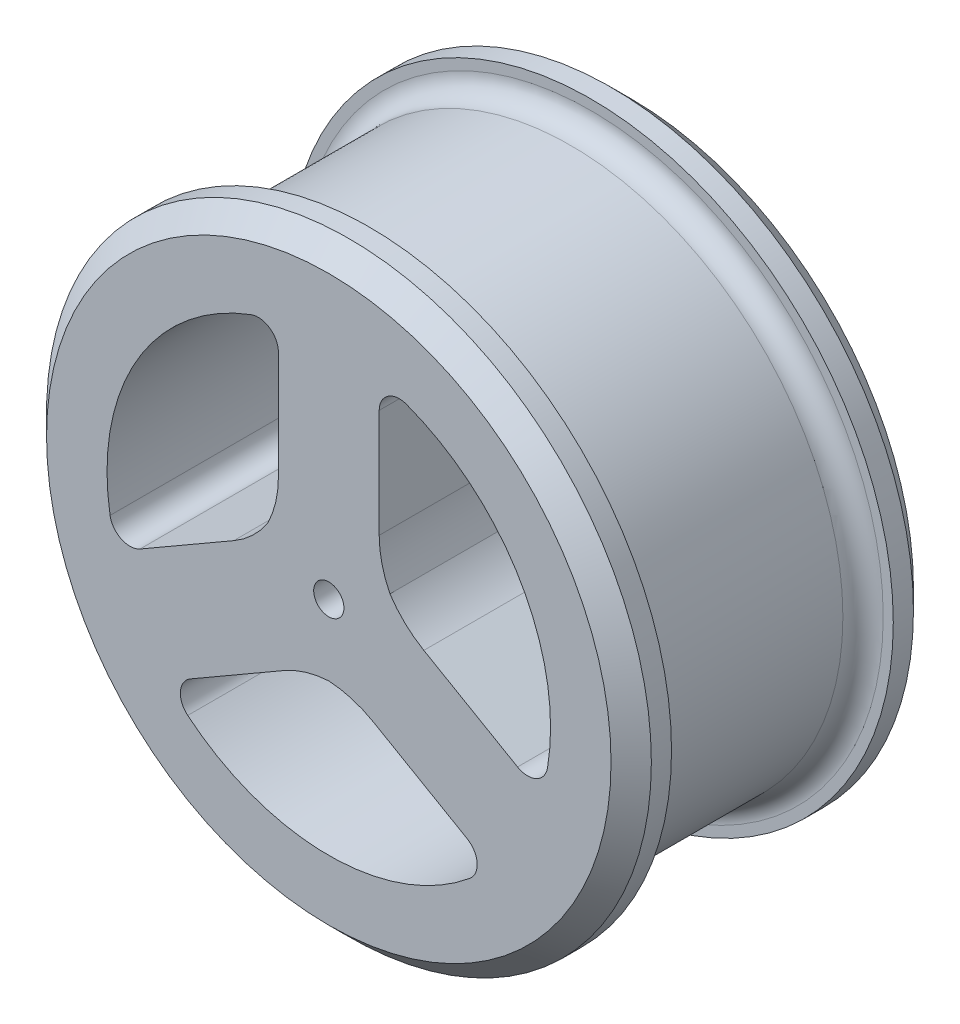
ISO-10303-21;
HEADER;
FILE_DESCRIPTION(('STEP AP214'),'2;1');
FILE_NAME('part.step','',(''),(''),'','','');
FILE_SCHEMA(('AUTOMOTIVE_DESIGN { 1 0 10303 214 1 1 1 1 }'));
ENDSEC;
DATA;
#1=APPLICATION_CONTEXT('core data for automotive mechanical design processes');
#2=APPLICATION_PROTOCOL_DEFINITION('international standard','automotive_design',2000,#1);
#3=PRODUCT_CONTEXT('',#1,'mechanical');
#4=PRODUCT('Part','Part','',(#3));
#5=PRODUCT_RELATED_PRODUCT_CATEGORY('part','',(#4));
#6=PRODUCT_DEFINITION_FORMATION('','',#4);
#7=PRODUCT_DEFINITION_CONTEXT('part definition',#1,'design');
#8=PRODUCT_DEFINITION('design','',#6,#7);
#9=PRODUCT_DEFINITION_SHAPE('','',#8);
#10=(LENGTH_UNIT() NAMED_UNIT(*) SI_UNIT(.MILLI.,.METRE.));
#11=(NAMED_UNIT(*) PLANE_ANGLE_UNIT() SI_UNIT($,.RADIAN.));
#12=(NAMED_UNIT(*) SI_UNIT($,.STERADIAN.) SOLID_ANGLE_UNIT());
#13=UNCERTAINTY_MEASURE_WITH_UNIT(LENGTH_MEASURE(1.E-05),#10,'distance_accuracy_value','');
#14=(GEOMETRIC_REPRESENTATION_CONTEXT(3) GLOBAL_UNCERTAINTY_ASSIGNED_CONTEXT((#13)) GLOBAL_UNIT_ASSIGNED_CONTEXT((#10,
#11,#12)) REPRESENTATION_CONTEXT('',''));
#15=CARTESIAN_POINT('',(0.,0.,0.));
#16=DIRECTION('',(0.,0.,1.));
#17=DIRECTION('',(1.,0.,0.));
#18=AXIS2_PLACEMENT_3D('',#15,#16,#17);
#19=CARTESIAN_POINT('',(0.,0.,15.));
#20=DIRECTION('',(0.,0.,-1.));
#21=DIRECTION('',(-1.,0.,0.));
#22=AXIS2_PLACEMENT_3D('',#19,#20,#21);
#23=CYLINDRICAL_SURFACE('',#22,15.);
#24=CARTESIAN_POINT('',(0.,0.,1.));
#25=DIRECTION('',(0.,0.,1.));
#26=DIRECTION('',(1.,0.,0.));
#27=AXIS2_PLACEMENT_3D('',#24,#25,#26);
#28=CIRCLE('',#27,15.);
#29=CARTESIAN_POINT('',(15.,0.,1.));
#30=VERTEX_POINT('',#29);
#31=EDGE_CURVE('E373',#30,#30,#28,.T.);
#32=ORIENTED_EDGE('',*,*,#31,.T.);
#33=EDGE_LOOP('',(#32));
#34=FACE_BOUND('',#33,.T.);
#35=CARTESIAN_POINT('',(0.,0.,2.));
#36=DIRECTION('',(0.,0.,1.));
#37=DIRECTION('',(1.,0.,0.));
#38=AXIS2_PLACEMENT_3D('',#35,#36,#37);
#39=CIRCLE('',#38,15.);
#40=CARTESIAN_POINT('',(15.,0.,2.));
#41=VERTEX_POINT('',#40);
#42=EDGE_CURVE('E263',#41,#41,#39,.T.);
#43=ORIENTED_EDGE('',*,*,#42,.F.);
#44=EDGE_LOOP('',(#43));
#45=FACE_BOUND('',#44,.T.);
#46=ADVANCED_FACE('F42',(#34,#45),#23,.T.);
#47=CARTESIAN_POINT('',(0.,0.,15.));
#48=DIRECTION('',(0.,0.,1.));
#49=DIRECTION('',(1.,0.,0.));
#50=AXIS2_PLACEMENT_3D('',#47,#48,#49);
#51=PLANE('',#50);
#52=CARTESIAN_POINT('',(0.,0.,15.));
#53=DIRECTION('',(0.,0.,1.));
#54=DIRECTION('',(1.,0.,0.));
#55=AXIS2_PLACEMENT_3D('',#52,#53,#54);
#56=CIRCLE('',#55,14.);
#57=CARTESIAN_POINT('',(14.,0.,15.));
#58=VERTEX_POINT('',#57);
#59=EDGE_CURVE('E51',#58,#58,#56,.T.);
#60=ORIENTED_EDGE('',*,*,#59,.T.);
#61=EDGE_LOOP('',(#60));
#62=FACE_BOUND('',#61,.T.);
#63=DIRECTION('',(0.,1.,0.));
#64=VECTOR('',#63,1.);
#65=CARTESIAN_POINT('',(-2.5,0.,15.));
#66=LINE('',#65,#64);
#67=CARTESIAN_POINT('',(-2.5,4.,15.));
#68=VERTEX_POINT('',#67);
#69=CARTESIAN_POINT('',(-2.5,9.3674969975976,15.));
#70=VERTEX_POINT('',#69);
#71=EDGE_CURVE('E238',#68,#70,#66,.T.);
#72=ORIENTED_EDGE('',*,*,#71,.F.);
#73=CARTESIAN_POINT('',(-7.5,4.,15.));
#74=DIRECTION('',(0.,0.,1.));
#75=DIRECTION('',(1.,0.,0.));
#76=AXIS2_PLACEMENT_3D('',#73,#74,#75);
#77=CIRCLE('',#76,5.);
#78=CARTESIAN_POINT('',(-3.03400829272474,1.7516855045282,15.));
#79=VERTEX_POINT('',#78);
#80=EDGE_CURVE('E312',#68,#79,#77,.F.);
#81=ORIENTED_EDGE('',*,*,#80,.T.);
#82=CARTESIAN_POINT('',(-7.21410161513773,4.49519052838332,15.));
#83=DIRECTION('',(0.,0.,1.));
#84=DIRECTION('',(1.,0.,0.));
#85=AXIS2_PLACEMENT_3D('',#82,#83,#84);
#86=CIRCLE('',#85,5.);
#87=CARTESIAN_POINT('',(-4.71410161513779,0.1650635094611,15.));
#88=VERTEX_POINT('',#87);
#89=EDGE_CURVE('E308',#79,#88,#86,.F.);
#90=ORIENTED_EDGE('',*,*,#89,.T.);
#91=DIRECTION('',(-0.866025403784445,-0.49999999999999,0.));
#92=VECTOR('',#91,1.);
#93=CARTESIAN_POINT('',(-1.24999999999996,2.16506350946109,15.));
#94=LINE('',#93,#92);
#95=CARTESIAN_POINT('',(-9.362490369794,-2.51868498933762,15.));
#96=VERTEX_POINT('',#95);
#97=EDGE_CURVE('E235',#88,#96,#94,.T.);
#98=ORIENTED_EDGE('',*,*,#97,.T.);
#99=CARTESIAN_POINT('',(-9.86249036979399,-1.65265958555317,15.));
#100=DIRECTION('',(0.,0.,1.));
#101=DIRECTION('',(1.,0.,0.));
#102=AXIS2_PLACEMENT_3D('',#99,#100,#101);
#103=CIRCLE('',#102,1.);
#104=CARTESIAN_POINT('',(-10.8487394067734,-1.81792554410849,15.));
#105=VERTEX_POINT('',#104);
#106=EDGE_CURVE('E352',#96,#105,#103,.F.);
#107=ORIENTED_EDGE('',*,*,#106,.T.);
#108=CARTESIAN_POINT('',(0.,0.,15.));
#109=DIRECTION('',(0.,0.,1.));
#110=DIRECTION('',(1.,0.,0.));
#111=AXIS2_PLACEMENT_3D('',#108,#109,#110);
#112=CIRCLE('',#111,11.);
#113=CARTESIAN_POINT('',(-3.85,10.3042466973574,15.));
#114=VERTEX_POINT('',#113);
#115=EDGE_CURVE('E241',#114,#105,#112,.T.);
#116=ORIENTED_EDGE('',*,*,#115,.F.);
#117=CARTESIAN_POINT('',(-3.5,9.3674969975976,15.));
#118=DIRECTION('',(0.,0.,1.));
#119=DIRECTION('',(1.,0.,0.));
#120=AXIS2_PLACEMENT_3D('',#117,#118,#119);
#121=CIRCLE('',#120,1.);
#122=EDGE_CURVE('E367',#114,#70,#121,.F.);
#123=ORIENTED_EDGE('',*,*,#122,.T.);
#124=EDGE_LOOP('',(#72,#81,#90,#98,#107,#116,#123));
#125=FACE_BOUND('',#124,.T.);
#126=CARTESIAN_POINT('',(0.285898384862207,-8.49519052838329,15.));
#127=DIRECTION('',(0.,0.,1.));
#128=DIRECTION('',(1.,0.,0.));
#129=AXIS2_PLACEMENT_3D('',#126,#127,#128);
#130=CIRCLE('',#129,5.);
#131=CARTESIAN_POINT('',(-2.21410161513774,-4.16506350946107,15.));
#132=VERTEX_POINT('',#131);
#133=CARTESIAN_POINT('',(0.,-3.50337100905638,15.));
#134=VERTEX_POINT('',#133);
#135=EDGE_CURVE('E189',#132,#134,#130,.F.);
#136=ORIENTED_EDGE('',*,*,#135,.T.);
#137=CARTESIAN_POINT('',(-0.285898384862262,-8.49519052838329,15.));
#138=DIRECTION('',(0.,0.,1.));
#139=DIRECTION('',(1.,0.,0.));
#140=AXIS2_PLACEMENT_3D('',#137,#138,#139);
#141=CIRCLE('',#140,5.);
#142=CARTESIAN_POINT('',(2.21410161513777,-4.16506350946111,15.));
#143=VERTEX_POINT('',#142);
#144=EDGE_CURVE('E296',#134,#143,#141,.F.);
#145=ORIENTED_EDGE('',*,*,#144,.T.);
#146=DIRECTION('',(0.866025403784436,-0.500000000000005,0.));
#147=VECTOR('',#146,1.);
#148=CARTESIAN_POINT('',(-1.25000000000001,-2.16506350946108,15.));
#149=LINE('',#148,#147);
#150=CARTESIAN_POINT('',(6.86249036979395,-6.84881200825993,15.));
#151=VERTEX_POINT('',#150);
#152=EDGE_CURVE('E221',#143,#151,#149,.T.);
#153=ORIENTED_EDGE('',*,*,#152,.T.);
#154=CARTESIAN_POINT('',(6.36249036979394,-7.71483741204436,15.));
#155=DIRECTION('',(0.,0.,1.));
#156=DIRECTION('',(1.,0.,0.));
#157=AXIS2_PLACEMENT_3D('',#154,#155,#156);
#158=CIRCLE('',#157,1.);
#159=CARTESIAN_POINT('',(6.99873940677333,-8.4863211532488,15.));
#160=VERTEX_POINT('',#159);
#161=EDGE_CURVE('E359',#151,#160,#158,.F.);
#162=ORIENTED_EDGE('',*,*,#161,.T.);
#163=CARTESIAN_POINT('',(0.,0.,15.));
#164=DIRECTION('',(0.,0.,1.));
#165=DIRECTION('',(1.,0.,0.));
#166=AXIS2_PLACEMENT_3D('',#163,#164,#165);
#167=CIRCLE('',#166,11.);
#168=CARTESIAN_POINT('',(-6.99873940677345,-8.4863211532487,15.));
#169=VERTEX_POINT('',#168);
#170=EDGE_CURVE('E217',#169,#160,#167,.T.);
#171=ORIENTED_EDGE('',*,*,#170,.F.);
#172=CARTESIAN_POINT('',(-6.36249036979404,-7.71483741204428,15.));
#173=DIRECTION('',(0.,0.,1.));
#174=DIRECTION('',(1.,0.,0.));
#175=AXIS2_PLACEMENT_3D('',#172,#173,#174);
#176=CIRCLE('',#175,1.);
#177=CARTESIAN_POINT('',(-6.86249036979403,-6.84881200825983,15.));
#178=VERTEX_POINT('',#177);
#179=EDGE_CURVE('E216',#169,#178,#176,.F.);
#180=ORIENTED_EDGE('',*,*,#179,.T.);
#181=DIRECTION('',(-0.866025403784445,-0.499999999999989,0.));
#182=VECTOR('',#181,1.);
#183=CARTESIAN_POINT('',(1.24999999999999,-2.16506350946114,15.));
#184=LINE('',#183,#182);
#185=EDGE_CURVE('E206',#132,#178,#184,.T.);
#186=ORIENTED_EDGE('',*,*,#185,.F.);
#187=EDGE_LOOP('',(#136,#145,#153,#162,#171,#180,#186));
#188=FACE_BOUND('',#187,.T.);
#189=CARTESIAN_POINT('',(7.21410161513777,4.49519052838327,15.));
#190=DIRECTION('',(0.,0.,1.));
#191=DIRECTION('',(1.,0.,0.));
#192=AXIS2_PLACEMENT_3D('',#189,#190,#191);
#193=CIRCLE('',#192,5.);
#194=CARTESIAN_POINT('',(4.71410161513774,0.165063509461094,15.));
#195=VERTEX_POINT('',#194);
#196=CARTESIAN_POINT('',(3.03400829272474,1.75168550452819,15.));
#197=VERTEX_POINT('',#196);
#198=EDGE_CURVE('E300',#195,#197,#193,.F.);
#199=ORIENTED_EDGE('',*,*,#198,.T.);
#200=CARTESIAN_POINT('',(7.5,4.,15.));
#201=DIRECTION('',(0.,0.,1.));
#202=DIRECTION('',(1.,0.,0.));
#203=AXIS2_PLACEMENT_3D('',#200,#201,#202);
#204=CIRCLE('',#203,5.);
#205=CARTESIAN_POINT('',(2.5,4.,15.));
#206=VERTEX_POINT('',#205);
#207=EDGE_CURVE('E304',#197,#206,#204,.F.);
#208=ORIENTED_EDGE('',*,*,#207,.T.);
#209=DIRECTION('',(0.,1.,0.));
#210=VECTOR('',#209,1.);
#211=CARTESIAN_POINT('',(2.5,0.,15.));
#212=LINE('',#211,#210);
#213=CARTESIAN_POINT('',(2.5,9.3674969975976,15.));
#214=VERTEX_POINT('',#213);
#215=EDGE_CURVE('E250',#206,#214,#212,.T.);
#216=ORIENTED_EDGE('',*,*,#215,.T.);
#217=CARTESIAN_POINT('',(3.5,9.3674969975976,15.));
#218=DIRECTION('',(0.,0.,1.));
#219=DIRECTION('',(1.,0.,0.));
#220=AXIS2_PLACEMENT_3D('',#217,#218,#219);
#221=CIRCLE('',#220,1.);
#222=CARTESIAN_POINT('',(3.85,10.3042466973574,15.));
#223=VERTEX_POINT('',#222);
#224=EDGE_CURVE('E66',#214,#223,#221,.F.);
#225=ORIENTED_EDGE('',*,*,#224,.T.);
#226=CARTESIAN_POINT('',(0.,0.,15.));
#227=DIRECTION('',(0.,0.,1.));
#228=DIRECTION('',(1.,0.,0.));
#229=AXIS2_PLACEMENT_3D('',#226,#227,#228);
#230=CIRCLE('',#229,11.);
#231=CARTESIAN_POINT('',(10.8487394067734,-1.81792554410864,15.));
#232=VERTEX_POINT('',#231);
#233=EDGE_CURVE('E258',#232,#223,#230,.T.);
#234=ORIENTED_EDGE('',*,*,#233,.F.);
#235=CARTESIAN_POINT('',(9.86249036979397,-1.65265958555331,15.));
#236=DIRECTION('',(0.,0.,1.));
#237=DIRECTION('',(1.,0.,0.));
#238=AXIS2_PLACEMENT_3D('',#235,#236,#237);
#239=CIRCLE('',#238,1.);
#240=CARTESIAN_POINT('',(9.36249036979396,-2.51868498933774,15.));
#241=VERTEX_POINT('',#240);
#242=EDGE_CURVE('E363',#232,#241,#239,.F.);
#243=ORIENTED_EDGE('',*,*,#242,.T.);
#244=DIRECTION('',(0.866025403784436,-0.500000000000005,0.));
#245=VECTOR('',#244,1.);
#246=CARTESIAN_POINT('',(1.25000000000002,2.1650635094611,15.));
#247=LINE('',#246,#245);
#248=EDGE_CURVE('E255',#195,#241,#247,.T.);
#249=ORIENTED_EDGE('',*,*,#248,.F.);
#250=EDGE_LOOP('',(#199,#208,#216,#225,#234,#243,#249));
#251=FACE_BOUND('',#250,.T.);
#252=CARTESIAN_POINT('',(0.,0.,15.));
#253=DIRECTION('',(0.,0.,1.));
#254=DIRECTION('',(1.,0.,0.));
#255=AXIS2_PLACEMENT_3D('',#252,#253,#254);
#256=CIRCLE('',#255,0.75);
#257=CARTESIAN_POINT('',(0.75,0.,15.));
#258=VERTEX_POINT('',#257);
#259=EDGE_CURVE('E269',#258,#258,#256,.T.);
#260=ORIENTED_EDGE('',*,*,#259,.F.);
#261=EDGE_LOOP('',(#260));
#262=FACE_BOUND('',#261,.T.);
#263=ADVANCED_FACE('F213',(#62,#125,#188,#251,#262),#51,.T.);
#264=CARTESIAN_POINT('',(0.,0.,0.));
#265=DIRECTION('',(0.,0.,1.));
#266=DIRECTION('',(1.,0.,0.));
#267=AXIS2_PLACEMENT_3D('',#264,#265,#266);
#268=PLANE('',#267);
#269=CARTESIAN_POINT('',(0.,0.,0.));
#270=DIRECTION('',(0.,0.,1.));
#271=DIRECTION('',(1.,0.,0.));
#272=AXIS2_PLACEMENT_3D('',#269,#270,#271);
#273=CIRCLE('',#272,14.);
#274=CARTESIAN_POINT('',(14.,0.,0.));
#275=VERTEX_POINT('',#274);
#276=EDGE_CURVE('E376',#275,#275,#273,.F.);
#277=ORIENTED_EDGE('',*,*,#276,.T.);
#278=EDGE_LOOP('',(#277));
#279=FACE_BOUND('',#278,.T.);
#280=CARTESIAN_POINT('',(-7.21410161513773,4.49519052838332,0.));
#281=DIRECTION('',(0.,0.,1.));
#282=DIRECTION('',(1.,0.,0.));
#283=AXIS2_PLACEMENT_3D('',#280,#281,#282);
#284=CIRCLE('',#283,5.);
#285=CARTESIAN_POINT('',(-4.71410161513779,0.1650635094611,0.));
#286=VERTEX_POINT('',#285);
#287=CARTESIAN_POINT('',(-3.03400829272474,1.7516855045282,0.));
#288=VERTEX_POINT('',#287);
#289=EDGE_CURVE('E310',#286,#288,#284,.T.);
#290=ORIENTED_EDGE('',*,*,#289,.T.);
#291=CARTESIAN_POINT('',(-7.5,4.,0.));
#292=DIRECTION('',(0.,0.,1.));
#293=DIRECTION('',(1.,0.,0.));
#294=AXIS2_PLACEMENT_3D('',#291,#292,#293);
#295=CIRCLE('',#294,5.);
#296=CARTESIAN_POINT('',(-2.5,4.,0.));
#297=VERTEX_POINT('',#296);
#298=EDGE_CURVE('E314',#288,#297,#295,.T.);
#299=ORIENTED_EDGE('',*,*,#298,.T.);
#300=DIRECTION('',(0.,1.,0.));
#301=VECTOR('',#300,1.);
#302=CARTESIAN_POINT('',(-2.5,0.,0.));
#303=LINE('',#302,#301);
#304=CARTESIAN_POINT('',(-2.5,9.3674969975976,0.));
#305=VERTEX_POINT('',#304);
#306=EDGE_CURVE('E232',#297,#305,#303,.T.);
#307=ORIENTED_EDGE('',*,*,#306,.T.);
#308=CARTESIAN_POINT('',(-3.5,9.3674969975976,0.));
#309=DIRECTION('',(0.,0.,1.));
#310=DIRECTION('',(1.,0.,0.));
#311=AXIS2_PLACEMENT_3D('',#308,#309,#310);
#312=CIRCLE('',#311,1.);
#313=CARTESIAN_POINT('',(-3.85,10.3042466973574,0.));
#314=VERTEX_POINT('',#313);
#315=EDGE_CURVE('E369',#305,#314,#312,.T.);
#316=ORIENTED_EDGE('',*,*,#315,.T.);
#317=CARTESIAN_POINT('',(0.,0.,0.));
#318=DIRECTION('',(0.,0.,1.));
#319=DIRECTION('',(1.,0.,0.));
#320=AXIS2_PLACEMENT_3D('',#317,#318,#319);
#321=CIRCLE('',#320,11.);
#322=CARTESIAN_POINT('',(-10.8487394067734,-1.81792554410849,0.));
#323=VERTEX_POINT('',#322);
#324=EDGE_CURVE('E224',#314,#323,#321,.T.);
#325=ORIENTED_EDGE('',*,*,#324,.T.);
#326=CARTESIAN_POINT('',(-9.86249036979399,-1.65265958555317,0.));
#327=DIRECTION('',(0.,0.,1.));
#328=DIRECTION('',(1.,0.,0.));
#329=AXIS2_PLACEMENT_3D('',#326,#327,#328);
#330=CIRCLE('',#329,1.);
#331=CARTESIAN_POINT('',(-9.362490369794,-2.51868498933762,0.));
#332=VERTEX_POINT('',#331);
#333=EDGE_CURVE('E354',#323,#332,#330,.T.);
#334=ORIENTED_EDGE('',*,*,#333,.T.);
#335=DIRECTION('',(-0.866025403784445,-0.49999999999999,0.));
#336=VECTOR('',#335,1.);
#337=CARTESIAN_POINT('',(-1.24999999999996,2.16506350946109,0.));
#338=LINE('',#337,#336);
#339=EDGE_CURVE('E218',#286,#332,#338,.T.);
#340=ORIENTED_EDGE('',*,*,#339,.F.);
#341=EDGE_LOOP('',(#290,#299,#307,#316,#325,#334,#340));
#342=FACE_BOUND('',#341,.T.);
#343=DIRECTION('',(0.866025403784436,-0.500000000000005,0.));
#344=VECTOR('',#343,1.);
#345=CARTESIAN_POINT('',(-1.25000000000001,-2.16506350946108,0.));
#346=LINE('',#345,#344);
#347=CARTESIAN_POINT('',(2.21410161513777,-4.16506350946111,0.));
#348=VERTEX_POINT('',#347);
#349=CARTESIAN_POINT('',(6.86249036979395,-6.84881200825993,0.));
#350=VERTEX_POINT('',#349);
#351=EDGE_CURVE('E227',#348,#350,#346,.T.);
#352=ORIENTED_EDGE('',*,*,#351,.F.);
#353=CARTESIAN_POINT('',(-0.285898384862262,-8.49519052838329,0.));
#354=DIRECTION('',(0.,0.,1.));
#355=DIRECTION('',(1.,0.,0.));
#356=AXIS2_PLACEMENT_3D('',#353,#354,#355);
#357=CIRCLE('',#356,5.);
#358=CARTESIAN_POINT('',(0.,-3.50337100905638,0.));
#359=VERTEX_POINT('',#358);
#360=EDGE_CURVE('E298',#348,#359,#357,.T.);
#361=ORIENTED_EDGE('',*,*,#360,.T.);
#362=CARTESIAN_POINT('',(0.285898384862207,-8.49519052838329,0.));
#363=DIRECTION('',(0.,0.,1.));
#364=DIRECTION('',(1.,0.,0.));
#365=AXIS2_PLACEMENT_3D('',#362,#363,#364);
#366=CIRCLE('',#365,5.);
#367=CARTESIAN_POINT('',(-2.21410161513774,-4.16506350946107,0.));
#368=VERTEX_POINT('',#367);
#369=EDGE_CURVE('E199',#359,#368,#366,.T.);
#370=ORIENTED_EDGE('',*,*,#369,.T.);
#371=DIRECTION('',(-0.866025403784445,-0.499999999999989,0.));
#372=VECTOR('',#371,1.);
#373=CARTESIAN_POINT('',(1.24999999999999,-2.16506350946114,0.));
#374=LINE('',#373,#372);
#375=CARTESIAN_POINT('',(-6.86249036979403,-6.84881200825983,0.));
#376=VERTEX_POINT('',#375);
#377=EDGE_CURVE('E209',#368,#376,#374,.T.);
#378=ORIENTED_EDGE('',*,*,#377,.T.);
#379=CARTESIAN_POINT('',(-6.36249036979404,-7.71483741204428,0.));
#380=DIRECTION('',(0.,0.,1.));
#381=DIRECTION('',(1.,0.,0.));
#382=AXIS2_PLACEMENT_3D('',#379,#380,#381);
#383=CIRCLE('',#382,1.);
#384=CARTESIAN_POINT('',(-6.99873940677345,-8.4863211532487,0.));
#385=VERTEX_POINT('',#384);
#386=EDGE_CURVE('E357',#376,#385,#383,.T.);
#387=ORIENTED_EDGE('',*,*,#386,.T.);
#388=CARTESIAN_POINT('',(0.,0.,0.));
#389=DIRECTION('',(0.,0.,1.));
#390=DIRECTION('',(1.,0.,0.));
#391=AXIS2_PLACEMENT_3D('',#388,#389,#390);
#392=CIRCLE('',#391,11.);
#393=CARTESIAN_POINT('',(6.99873940677333,-8.4863211532488,0.));
#394=VERTEX_POINT('',#393);
#395=EDGE_CURVE('E477',#385,#394,#392,.T.);
#396=ORIENTED_EDGE('',*,*,#395,.T.);
#397=CARTESIAN_POINT('',(6.36249036979394,-7.71483741204436,0.));
#398=DIRECTION('',(0.,0.,1.));
#399=DIRECTION('',(1.,0.,0.));
#400=AXIS2_PLACEMENT_3D('',#397,#398,#399);
#401=CIRCLE('',#400,1.);
#402=EDGE_CURVE('E361',#394,#350,#401,.T.);
#403=ORIENTED_EDGE('',*,*,#402,.T.);
#404=EDGE_LOOP('',(#352,#361,#370,#378,#387,#396,#403));
#405=FACE_BOUND('',#404,.T.);
#406=DIRECTION('',(0.,1.,0.));
#407=VECTOR('',#406,1.);
#408=CARTESIAN_POINT('',(2.5,0.,0.));
#409=LINE('',#408,#407);
#410=CARTESIAN_POINT('',(2.5,4.,0.));
#411=VERTEX_POINT('',#410);
#412=CARTESIAN_POINT('',(2.5,9.3674969975976,0.));
#413=VERTEX_POINT('',#412);
#414=EDGE_CURVE('E252',#411,#413,#409,.T.);
#415=ORIENTED_EDGE('',*,*,#414,.F.);
#416=CARTESIAN_POINT('',(7.5,4.,0.));
#417=DIRECTION('',(0.,0.,1.));
#418=DIRECTION('',(1.,0.,0.));
#419=AXIS2_PLACEMENT_3D('',#416,#417,#418);
#420=CIRCLE('',#419,5.);
#421=CARTESIAN_POINT('',(3.03400829272474,1.75168550452819,0.));
#422=VERTEX_POINT('',#421);
#423=EDGE_CURVE('E306',#411,#422,#420,.T.);
#424=ORIENTED_EDGE('',*,*,#423,.T.);
#425=CARTESIAN_POINT('',(7.21410161513777,4.49519052838327,0.));
#426=DIRECTION('',(0.,0.,1.));
#427=DIRECTION('',(1.,0.,0.));
#428=AXIS2_PLACEMENT_3D('',#425,#426,#427);
#429=CIRCLE('',#428,5.);
#430=CARTESIAN_POINT('',(4.71410161513774,0.165063509461094,0.));
#431=VERTEX_POINT('',#430);
#432=EDGE_CURVE('E302',#422,#431,#429,.T.);
#433=ORIENTED_EDGE('',*,*,#432,.T.);
#434=DIRECTION('',(0.866025403784436,-0.500000000000005,0.));
#435=VECTOR('',#434,1.);
#436=CARTESIAN_POINT('',(1.25000000000002,2.1650635094611,0.));
#437=LINE('',#436,#435);
#438=CARTESIAN_POINT('',(9.36249036979396,-2.51868498933774,0.));
#439=VERTEX_POINT('',#438);
#440=EDGE_CURVE('E246',#431,#439,#437,.T.);
#441=ORIENTED_EDGE('',*,*,#440,.T.);
#442=CARTESIAN_POINT('',(9.86249036979397,-1.65265958555331,0.));
#443=DIRECTION('',(0.,0.,1.));
#444=DIRECTION('',(1.,0.,0.));
#445=AXIS2_PLACEMENT_3D('',#442,#443,#444);
#446=CIRCLE('',#445,1.);
#447=CARTESIAN_POINT('',(10.8487394067734,-1.81792554410864,0.));
#448=VERTEX_POINT('',#447);
#449=EDGE_CURVE('E365',#439,#448,#446,.T.);
#450=ORIENTED_EDGE('',*,*,#449,.T.);
#451=CARTESIAN_POINT('',(0.,0.,0.));
#452=DIRECTION('',(0.,0.,1.));
#453=DIRECTION('',(1.,0.,0.));
#454=AXIS2_PLACEMENT_3D('',#451,#452,#453);
#455=CIRCLE('',#454,11.);
#456=CARTESIAN_POINT('',(3.85,10.3042466973574,0.));
#457=VERTEX_POINT('',#456);
#458=EDGE_CURVE('E249',#448,#457,#455,.T.);
#459=ORIENTED_EDGE('',*,*,#458,.T.);
#460=CARTESIAN_POINT('',(3.5,9.3674969975976,0.));
#461=DIRECTION('',(0.,0.,1.));
#462=DIRECTION('',(1.,0.,0.));
#463=AXIS2_PLACEMENT_3D('',#460,#461,#462);
#464=CIRCLE('',#463,1.);
#465=EDGE_CURVE('E58',#457,#413,#464,.T.);
#466=ORIENTED_EDGE('',*,*,#465,.T.);
#467=EDGE_LOOP('',(#415,#424,#433,#441,#450,#459,#466));
#468=FACE_BOUND('',#467,.T.);
#469=CARTESIAN_POINT('',(0.,0.,0.));
#470=DIRECTION('',(0.,0.,1.));
#471=DIRECTION('',(1.,0.,0.));
#472=AXIS2_PLACEMENT_3D('',#469,#470,#471);
#473=CIRCLE('',#472,0.75);
#474=CARTESIAN_POINT('',(0.75,0.,0.));
#475=VERTEX_POINT('',#474);
#476=EDGE_CURVE('E266',#475,#475,#473,.T.);
#477=ORIENTED_EDGE('',*,*,#476,.T.);
#478=EDGE_LOOP('',(#477));
#479=FACE_BOUND('',#478,.T.);
#480=ADVANCED_FACE('F399',(#279,#342,#405,#468,#479),#268,.F.);
#481=CARTESIAN_POINT('',(0.,0.,14.));
#482=DIRECTION('',(0.,0.,1.));
#483=DIRECTION('',(1.,0.,0.));
#484=AXIS2_PLACEMENT_3D('',#481,#482,#483);
#485=CIRCLE('',#484,15.);
#486=CARTESIAN_POINT('',(15.,0.,14.));
#487=VERTEX_POINT('',#486);
#488=EDGE_CURVE('E11',#487,#487,#485,.F.);
#489=ORIENTED_EDGE('',*,*,#488,.T.);
#490=EDGE_LOOP('',(#489));
#491=FACE_BOUND('',#490,.T.);
#492=CARTESIAN_POINT('',(0.,0.,13.));
#493=DIRECTION('',(0.,0.,1.));
#494=DIRECTION('',(1.,0.,0.));
#495=AXIS2_PLACEMENT_3D('',#492,#493,#494);
#496=CIRCLE('',#495,15.);
#497=CARTESIAN_POINT('',(15.,0.,13.));
#498=VERTEX_POINT('',#497);
#499=EDGE_CURVE('E254',#498,#498,#496,.T.);
#500=ORIENTED_EDGE('',*,*,#499,.T.);
#501=EDGE_LOOP('',(#500));
#502=FACE_BOUND('',#501,.T.);
#503=ADVANCED_FACE('F395',(#491,#502),#23,.T.);
#504=CARTESIAN_POINT('',(0.,0.,15.));
#505=DIRECTION('',(0.,0.,-1.));
#506=DIRECTION('',(-1.,0.,0.));
#507=AXIS2_PLACEMENT_3D('',#504,#505,#506);
#508=CYLINDRICAL_SURFACE('',#507,0.75);
#509=ORIENTED_EDGE('',*,*,#259,.T.);
#510=EDGE_LOOP('',(#509));
#511=FACE_BOUND('',#510,.T.);
#512=ORIENTED_EDGE('',*,*,#476,.F.);
#513=EDGE_LOOP('',(#512));
#514=FACE_BOUND('',#513,.T.);
#515=ADVANCED_FACE('F405',(#511,#514),#508,.F.);
#516=CARTESIAN_POINT('',(0.,0.,2.));
#517=DIRECTION('',(0.,0.,1.));
#518=DIRECTION('',(1.,0.,0.));
#519=AXIS2_PLACEMENT_3D('',#516,#517,#518);
#520=PLANE('',#519);
#521=CARTESIAN_POINT('',(0.,0.,2.));
#522=DIRECTION('',(0.,0.,1.));
#523=DIRECTION('',(1.,0.,0.));
#524=AXIS2_PLACEMENT_3D('',#521,#522,#523);
#525=CIRCLE('',#524,14.5);
#526=CARTESIAN_POINT('',(14.5,0.,2.));
#527=VERTEX_POINT('',#526);
#528=EDGE_CURVE('E211',#527,#527,#525,.F.);
#529=ORIENTED_EDGE('',*,*,#528,.T.);
#530=EDGE_LOOP('',(#529));
#531=FACE_BOUND('',#530,.T.);
#532=ORIENTED_EDGE('',*,*,#42,.T.);
#533=EDGE_LOOP('',(#532));
#534=FACE_BOUND('',#533,.T.);
#535=ADVANCED_FACE('F411',(#531,#534),#520,.T.);
#536=CARTESIAN_POINT('',(0.,0.,13.));
#537=DIRECTION('',(0.,0.,1.));
#538=DIRECTION('',(1.,0.,0.));
#539=AXIS2_PLACEMENT_3D('',#536,#537,#538);
#540=PLANE('',#539);
#541=CARTESIAN_POINT('',(0.,0.,13.));
#542=DIRECTION('',(0.,0.,1.));
#543=DIRECTION('',(1.,0.,0.));
#544=AXIS2_PLACEMENT_3D('',#541,#542,#543);
#545=CIRCLE('',#544,14.5);
#546=CARTESIAN_POINT('',(14.5,0.,13.));
#547=VERTEX_POINT('',#546);
#548=EDGE_CURVE('E272',#547,#547,#545,.T.);
#549=ORIENTED_EDGE('',*,*,#548,.T.);
#550=EDGE_LOOP('',(#549));
#551=FACE_BOUND('',#550,.T.);
#552=ORIENTED_EDGE('',*,*,#499,.F.);
#553=EDGE_LOOP('',(#552));
#554=FACE_BOUND('',#553,.T.);
#555=ADVANCED_FACE('F418',(#551,#554),#540,.F.);
#556=CARTESIAN_POINT('',(0.,0.,2.));
#557=DIRECTION('',(0.,0.,1.));
#558=DIRECTION('',(1.,0.,0.));
#559=AXIS2_PLACEMENT_3D('',#556,#557,#558);
#560=CYLINDRICAL_SURFACE('',#559,13.5);
#561=CARTESIAN_POINT('',(0.,0.,12.));
#562=DIRECTION('',(0.,0.,1.));
#563=DIRECTION('',(1.,0.,0.));
#564=AXIS2_PLACEMENT_3D('',#561,#562,#563);
#565=CIRCLE('',#564,13.5);
#566=CARTESIAN_POINT('',(13.5,0.,12.));
#567=VERTEX_POINT('',#566);
#568=EDGE_CURVE('E280',#567,#567,#565,.F.);
#569=ORIENTED_EDGE('',*,*,#568,.T.);
#570=EDGE_LOOP('',(#569));
#571=FACE_BOUND('',#570,.T.);
#572=CARTESIAN_POINT('',(0.,0.,3.));
#573=DIRECTION('',(0.,0.,1.));
#574=DIRECTION('',(1.,0.,0.));
#575=AXIS2_PLACEMENT_3D('',#572,#573,#574);
#576=CIRCLE('',#575,13.5);
#577=CARTESIAN_POINT('',(13.5,0.,3.));
#578=VERTEX_POINT('',#577);
#579=EDGE_CURVE('E277',#578,#578,#576,.T.);
#580=ORIENTED_EDGE('',*,*,#579,.T.);
#581=EDGE_LOOP('',(#580));
#582=FACE_BOUND('',#581,.T.);
#583=ADVANCED_FACE('F420',(#571,#582),#560,.T.);
#584=CARTESIAN_POINT('',(0.,0.,12.));
#585=DIRECTION('',(0.,0.,1.));
#586=DIRECTION('',(1.,0.,0.));
#587=AXIS2_PLACEMENT_3D('',#584,#585,#586);
#588=TOROIDAL_SURFACE('',#587,14.5,1.);
#589=ORIENTED_EDGE('',*,*,#568,.F.);
#590=EDGE_LOOP('',(#589));
#591=FACE_BOUND('',#590,.T.);
#592=ORIENTED_EDGE('',*,*,#548,.F.);
#593=EDGE_LOOP('',(#592));
#594=FACE_BOUND('',#593,.T.);
#595=ADVANCED_FACE('F427',(#591,#594),#588,.F.);
#596=CARTESIAN_POINT('',(0.,0.,3.));
#597=DIRECTION('',(0.,0.,1.));
#598=DIRECTION('',(1.,0.,0.));
#599=AXIS2_PLACEMENT_3D('',#596,#597,#598);
#600=TOROIDAL_SURFACE('',#599,14.5,1.);
#601=ORIENTED_EDGE('',*,*,#528,.F.);
#602=EDGE_LOOP('',(#601));
#603=FACE_BOUND('',#602,.T.);
#604=ORIENTED_EDGE('',*,*,#579,.F.);
#605=EDGE_LOOP('',(#604));
#606=FACE_BOUND('',#605,.T.);
#607=ADVANCED_FACE('F437',(#603,#606),#600,.F.);
#608=CARTESIAN_POINT('',(1.25000000000002,2.1650635094611,0.));
#609=DIRECTION('',(-0.500000000000005,-0.866025403784436,0.));
#610=DIRECTION('',(0.866025403784436,-0.500000000000005,0.));
#611=AXIS2_PLACEMENT_3D('',#608,#609,#610);
#612=PLANE('',#611);
#613=ORIENTED_EDGE('',*,*,#248,.T.);
#614=DIRECTION('',(0.,0.,-1.));
#615=VECTOR('',#614,1.);
#616=CARTESIAN_POINT('',(9.36249036979396,-2.51868498933774,0.));
#617=LINE('',#616,#615);
#618=EDGE_CURVE('E346',#241,#439,#617,.T.);
#619=ORIENTED_EDGE('',*,*,#618,.T.);
#620=ORIENTED_EDGE('',*,*,#440,.F.);
#621=DIRECTION('',(0.,0.,1.));
#622=VECTOR('',#621,1.);
#623=CARTESIAN_POINT('',(4.71410161513774,0.165063509461094,0.));
#624=LINE('',#623,#622);
#625=EDGE_CURVE('E286',#431,#195,#624,.T.);
#626=ORIENTED_EDGE('',*,*,#625,.T.);
#627=EDGE_LOOP('',(#613,#619,#620,#626));
#628=FACE_BOUND('',#627,.T.);
#629=ADVANCED_FACE('F433',(#628),#612,.F.);
#630=CARTESIAN_POINT('',(2.5,0.,0.));
#631=DIRECTION('',(1.,0.,0.));
#632=DIRECTION('',(0.,0.,-1.));
#633=AXIS2_PLACEMENT_3D('',#630,#631,#632);
#634=PLANE('',#633);
#635=ORIENTED_EDGE('',*,*,#414,.T.);
#636=DIRECTION('',(0.,0.,1.));
#637=VECTOR('',#636,1.);
#638=CARTESIAN_POINT('',(2.5,9.3674969975976,0.));
#639=LINE('',#638,#637);
#640=EDGE_CURVE('E350',#413,#214,#639,.T.);
#641=ORIENTED_EDGE('',*,*,#640,.T.);
#642=ORIENTED_EDGE('',*,*,#215,.F.);
#643=DIRECTION('',(0.,0.,-1.));
#644=VECTOR('',#643,1.);
#645=CARTESIAN_POINT('',(2.5,4.,0.));
#646=LINE('',#645,#644);
#647=EDGE_CURVE('E289',#206,#411,#646,.T.);
#648=ORIENTED_EDGE('',*,*,#647,.T.);
#649=EDGE_LOOP('',(#635,#641,#642,#648));
#650=FACE_BOUND('',#649,.T.);
#651=ADVANCED_FACE('F436',(#650),#634,.T.);
#652=CARTESIAN_POINT('',(0.,0.,0.));
#653=DIRECTION('',(0.,0.,1.));
#654=DIRECTION('',(1.,0.,0.));
#655=AXIS2_PLACEMENT_3D('',#652,#653,#654);
#656=CYLINDRICAL_SURFACE('',#655,11.);
#657=ORIENTED_EDGE('',*,*,#458,.F.);
#658=DIRECTION('',(0.,0.,1.));
#659=VECTOR('',#658,1.);
#660=CARTESIAN_POINT('',(10.8487394067734,-1.81792554410864,0.));
#661=LINE('',#660,#659);
#662=EDGE_CURVE('E343',#448,#232,#661,.T.);
#663=ORIENTED_EDGE('',*,*,#662,.T.);
#664=ORIENTED_EDGE('',*,*,#233,.T.);
#665=DIRECTION('',(0.,0.,1.));
#666=VECTOR('',#665,1.);
#667=CARTESIAN_POINT('',(3.85,10.3042466973574,0.));
#668=LINE('',#667,#666);
#669=EDGE_CURVE('E341',#223,#457,#668,.F.);
#670=ORIENTED_EDGE('',*,*,#669,.T.);
#671=EDGE_LOOP('',(#657,#663,#664,#670));
#672=FACE_BOUND('',#671,.T.);
#673=ADVANCED_FACE('F439',(#672),#656,.F.);
#674=CARTESIAN_POINT('',(1.24999999999999,-2.16506350946114,0.));
#675=DIRECTION('',(-0.499999999999989,0.866025403784445,0.));
#676=DIRECTION('',(-0.866025403784445,-0.49999999999999,0.));
#677=AXIS2_PLACEMENT_3D('',#674,#675,#676);
#678=PLANE('',#677);
#679=ORIENTED_EDGE('',*,*,#185,.T.);
#680=DIRECTION('',(0.,0.,-1.));
#681=VECTOR('',#680,1.);
#682=CARTESIAN_POINT('',(-6.86249036979403,-6.84881200825983,0.));
#683=LINE('',#682,#681);
#684=EDGE_CURVE('E336',#178,#376,#683,.T.);
#685=ORIENTED_EDGE('',*,*,#684,.T.);
#686=ORIENTED_EDGE('',*,*,#377,.F.);
#687=DIRECTION('',(0.,0.,1.));
#688=VECTOR('',#687,1.);
#689=CARTESIAN_POINT('',(-2.21410161513774,-4.16506350946107,0.));
#690=LINE('',#689,#688);
#691=EDGE_CURVE('E193',#368,#132,#690,.T.);
#692=ORIENTED_EDGE('',*,*,#691,.T.);
#693=EDGE_LOOP('',(#679,#685,#686,#692));
#694=FACE_BOUND('',#693,.T.);
#695=ADVANCED_FACE('F205',(#694),#678,.F.);
#696=CARTESIAN_POINT('',(-1.25000000000001,-2.16506350946108,0.));
#697=DIRECTION('',(-0.500000000000005,-0.866025403784436,0.));
#698=DIRECTION('',(0.866025403784436,-0.500000000000005,0.));
#699=AXIS2_PLACEMENT_3D('',#696,#697,#698);
#700=PLANE('',#699);
#701=ORIENTED_EDGE('',*,*,#351,.T.);
#702=DIRECTION('',(0.,0.,1.));
#703=VECTOR('',#702,1.);
#704=CARTESIAN_POINT('',(6.86249036979394,-6.84881200825992,0.));
#705=LINE('',#704,#703);
#706=EDGE_CURVE('E338',#350,#151,#705,.T.);
#707=ORIENTED_EDGE('',*,*,#706,.T.);
#708=ORIENTED_EDGE('',*,*,#152,.F.);
#709=DIRECTION('',(0.,0.,-1.));
#710=VECTOR('',#709,1.);
#711=CARTESIAN_POINT('',(2.21410161513776,-4.16506350946111,0.));
#712=LINE('',#711,#710);
#713=EDGE_CURVE('E210',#143,#348,#712,.T.);
#714=ORIENTED_EDGE('',*,*,#713,.T.);
#715=EDGE_LOOP('',(#701,#707,#708,#714));
#716=FACE_BOUND('',#715,.T.);
#717=ADVANCED_FACE('F462',(#716),#700,.T.);
#718=CARTESIAN_POINT('',(0.,0.,0.));
#719=DIRECTION('',(0.,0.,1.));
#720=DIRECTION('',(1.,0.,0.));
#721=AXIS2_PLACEMENT_3D('',#718,#719,#720);
#722=CYLINDRICAL_SURFACE('',#721,11.);
#723=ORIENTED_EDGE('',*,*,#395,.F.);
#724=DIRECTION('',(0.,0.,1.));
#725=VECTOR('',#724,1.);
#726=CARTESIAN_POINT('',(-6.99873940677345,-8.4863211532487,0.));
#727=LINE('',#726,#725);
#728=EDGE_CURVE('E333',#385,#169,#727,.T.);
#729=ORIENTED_EDGE('',*,*,#728,.T.);
#730=ORIENTED_EDGE('',*,*,#170,.T.);
#731=DIRECTION('',(0.,0.,1.));
#732=VECTOR('',#731,1.);
#733=CARTESIAN_POINT('',(6.99873940677334,-8.4863211532488,0.));
#734=LINE('',#733,#732);
#735=EDGE_CURVE('E331',#160,#394,#734,.F.);
#736=ORIENTED_EDGE('',*,*,#735,.T.);
#737=EDGE_LOOP('',(#723,#729,#730,#736));
#738=FACE_BOUND('',#737,.T.);
#739=ADVANCED_FACE('F450',(#738),#722,.F.);
#740=CARTESIAN_POINT('',(-2.5,0.,0.));
#741=DIRECTION('',(1.,0.,0.));
#742=DIRECTION('',(0.,1.,0.));
#743=AXIS2_PLACEMENT_3D('',#740,#741,#742);
#744=PLANE('',#743);
#745=ORIENTED_EDGE('',*,*,#71,.T.);
#746=DIRECTION('',(0.,0.,-1.));
#747=VECTOR('',#746,1.);
#748=CARTESIAN_POINT('',(-2.5,9.3674969975976,0.));
#749=LINE('',#748,#747);
#750=EDGE_CURVE('E348',#70,#305,#749,.T.);
#751=ORIENTED_EDGE('',*,*,#750,.T.);
#752=ORIENTED_EDGE('',*,*,#306,.F.);
#753=DIRECTION('',(0.,0.,1.));
#754=VECTOR('',#753,1.);
#755=CARTESIAN_POINT('',(-2.5,4.,0.));
#756=LINE('',#755,#754);
#757=EDGE_CURVE('E200',#297,#68,#756,.T.);
#758=ORIENTED_EDGE('',*,*,#757,.T.);
#759=EDGE_LOOP('',(#745,#751,#752,#758));
#760=FACE_BOUND('',#759,.T.);
#761=ADVANCED_FACE('F446',(#760),#744,.F.);
#762=CARTESIAN_POINT('',(-1.24999999999996,2.16506350946109,0.));
#763=DIRECTION('',(-0.49999999999999,0.866025403784445,0.));
#764=DIRECTION('',(-0.866025403784445,-0.49999999999999,0.));
#765=AXIS2_PLACEMENT_3D('',#762,#763,#764);
#766=PLANE('',#765);
#767=ORIENTED_EDGE('',*,*,#339,.T.);
#768=DIRECTION('',(0.,0.,1.));
#769=VECTOR('',#768,1.);
#770=CARTESIAN_POINT('',(-9.362490369794,-2.51868498933762,0.));
#771=LINE('',#770,#769);
#772=EDGE_CURVE('E316',#332,#96,#771,.T.);
#773=ORIENTED_EDGE('',*,*,#772,.T.);
#774=ORIENTED_EDGE('',*,*,#97,.F.);
#775=DIRECTION('',(0.,0.,-1.));
#776=VECTOR('',#775,1.);
#777=CARTESIAN_POINT('',(-4.71410161513779,0.165063509461101,0.));
#778=LINE('',#777,#776);
#779=EDGE_CURVE('E291',#88,#286,#778,.T.);
#780=ORIENTED_EDGE('',*,*,#779,.T.);
#781=EDGE_LOOP('',(#767,#773,#774,#780));
#782=FACE_BOUND('',#781,.T.);
#783=ADVANCED_FACE('F449',(#782),#766,.T.);
#784=CARTESIAN_POINT('',(0.,0.,0.));
#785=DIRECTION('',(0.,0.,1.));
#786=DIRECTION('',(1.,0.,0.));
#787=AXIS2_PLACEMENT_3D('',#784,#785,#786);
#788=CYLINDRICAL_SURFACE('',#787,11.);
#789=ORIENTED_EDGE('',*,*,#115,.T.);
#790=DIRECTION('',(0.,0.,1.));
#791=VECTOR('',#790,1.);
#792=CARTESIAN_POINT('',(-10.8487394067734,-1.81792554410849,0.));
#793=LINE('',#792,#791);
#794=EDGE_CURVE('E329',#105,#323,#793,.F.);
#795=ORIENTED_EDGE('',*,*,#794,.T.);
#796=ORIENTED_EDGE('',*,*,#324,.F.);
#797=DIRECTION('',(0.,0.,1.));
#798=VECTOR('',#797,1.);
#799=CARTESIAN_POINT('',(-3.85,10.3042466973574,0.));
#800=LINE('',#799,#798);
#801=EDGE_CURVE('E326',#314,#114,#800,.T.);
#802=ORIENTED_EDGE('',*,*,#801,.T.);
#803=EDGE_LOOP('',(#789,#795,#796,#802));
#804=FACE_BOUND('',#803,.T.);
#805=ADVANCED_FACE('F452',(#804),#788,.F.);
#806=CARTESIAN_POINT('',(-0.285898384862262,-8.49519052838329,0.));
#807=DIRECTION('',(0.,0.,1.));
#808=DIRECTION('',(1.,0.,0.));
#809=AXIS2_PLACEMENT_3D('',#806,#807,#808);
#810=CYLINDRICAL_SURFACE('',#809,5.);
#811=DIRECTION('',(0.,0.,1.));
#812=VECTOR('',#811,1.);
#813=CARTESIAN_POINT('',(0.,-3.50337100905638,7.5));
#814=LINE('',#813,#812);
#815=EDGE_CURVE('E195',#359,#134,#814,.T.);
#816=ORIENTED_EDGE('',*,*,#815,.F.);
#817=ORIENTED_EDGE('',*,*,#360,.F.);
#818=ORIENTED_EDGE('',*,*,#713,.F.);
#819=ORIENTED_EDGE('',*,*,#144,.F.);
#820=EDGE_LOOP('',(#816,#817,#818,#819));
#821=FACE_BOUND('',#820,.T.);
#822=ADVANCED_FACE('F455',(#821),#810,.F.);
#823=CARTESIAN_POINT('',(0.285898384862207,-8.49519052838329,0.));
#824=DIRECTION('',(0.,0.,1.));
#825=DIRECTION('',(1.,0.,0.));
#826=AXIS2_PLACEMENT_3D('',#823,#824,#825);
#827=CYLINDRICAL_SURFACE('',#826,5.);
#828=ORIENTED_EDGE('',*,*,#369,.F.);
#829=ORIENTED_EDGE('',*,*,#815,.T.);
#830=ORIENTED_EDGE('',*,*,#135,.F.);
#831=ORIENTED_EDGE('',*,*,#691,.F.);
#832=EDGE_LOOP('',(#828,#829,#830,#831));
#833=FACE_BOUND('',#832,.T.);
#834=ADVANCED_FACE('F192',(#833),#827,.F.);
#835=CARTESIAN_POINT('',(7.5,4.,0.));
#836=DIRECTION('',(0.,0.,1.));
#837=DIRECTION('',(1.,0.,0.));
#838=AXIS2_PLACEMENT_3D('',#835,#836,#837);
#839=CYLINDRICAL_SURFACE('',#838,5.);
#840=DIRECTION('',(0.,0.,1.));
#841=VECTOR('',#840,1.);
#842=CARTESIAN_POINT('',(3.03400829272474,1.75168550452819,7.5));
#843=LINE('',#842,#841);
#844=EDGE_CURVE('E318',#422,#197,#843,.T.);
#845=ORIENTED_EDGE('',*,*,#844,.F.);
#846=ORIENTED_EDGE('',*,*,#423,.F.);
#847=ORIENTED_EDGE('',*,*,#647,.F.);
#848=ORIENTED_EDGE('',*,*,#207,.F.);
#849=EDGE_LOOP('',(#845,#846,#847,#848));
#850=FACE_BOUND('',#849,.T.);
#851=ADVANCED_FACE('F495',(#850),#839,.F.);
#852=CARTESIAN_POINT('',(7.21410161513777,4.49519052838327,0.));
#853=DIRECTION('',(0.,0.,1.));
#854=DIRECTION('',(1.,0.,0.));
#855=AXIS2_PLACEMENT_3D('',#852,#853,#854);
#856=CYLINDRICAL_SURFACE('',#855,5.);
#857=ORIENTED_EDGE('',*,*,#432,.F.);
#858=ORIENTED_EDGE('',*,*,#844,.T.);
#859=ORIENTED_EDGE('',*,*,#198,.F.);
#860=ORIENTED_EDGE('',*,*,#625,.F.);
#861=EDGE_LOOP('',(#857,#858,#859,#860));
#862=FACE_BOUND('',#861,.T.);
#863=ADVANCED_FACE('F499',(#862),#856,.F.);
#864=CARTESIAN_POINT('',(-7.5,4.,0.));
#865=DIRECTION('',(0.,0.,1.));
#866=DIRECTION('',(1.,0.,0.));
#867=AXIS2_PLACEMENT_3D('',#864,#865,#866);
#868=CYLINDRICAL_SURFACE('',#867,5.);
#869=ORIENTED_EDGE('',*,*,#757,.F.);
#870=ORIENTED_EDGE('',*,*,#298,.F.);
#871=DIRECTION('',(0.,0.,1.));
#872=VECTOR('',#871,1.);
#873=CARTESIAN_POINT('',(-3.03400829272474,1.7516855045282,7.5));
#874=LINE('',#873,#872);
#875=EDGE_CURVE('E321',#79,#288,#874,.F.);
#876=ORIENTED_EDGE('',*,*,#875,.F.);
#877=ORIENTED_EDGE('',*,*,#80,.F.);
#878=EDGE_LOOP('',(#869,#870,#876,#877));
#879=FACE_BOUND('',#878,.T.);
#880=ADVANCED_FACE('F502',(#879),#868,.F.);
#881=CARTESIAN_POINT('',(-7.21410161513773,4.49519052838332,0.));
#882=DIRECTION('',(0.,0.,1.));
#883=DIRECTION('',(1.,0.,0.));
#884=AXIS2_PLACEMENT_3D('',#881,#882,#883);
#885=CYLINDRICAL_SURFACE('',#884,5.);
#886=ORIENTED_EDGE('',*,*,#289,.F.);
#887=ORIENTED_EDGE('',*,*,#779,.F.);
#888=ORIENTED_EDGE('',*,*,#89,.F.);
#889=ORIENTED_EDGE('',*,*,#875,.T.);
#890=EDGE_LOOP('',(#886,#887,#888,#889));
#891=FACE_BOUND('',#890,.T.);
#892=ADVANCED_FACE('F507',(#891),#885,.F.);
#893=CARTESIAN_POINT('',(-9.86249036979399,-1.65265958555317,0.));
#894=DIRECTION('',(0.,0.,1.));
#895=DIRECTION('',(1.,0.,0.));
#896=AXIS2_PLACEMENT_3D('',#893,#894,#895);
#897=CYLINDRICAL_SURFACE('',#896,1.);
#898=ORIENTED_EDGE('',*,*,#333,.F.);
#899=ORIENTED_EDGE('',*,*,#794,.F.);
#900=ORIENTED_EDGE('',*,*,#106,.F.);
#901=ORIENTED_EDGE('',*,*,#772,.F.);
#902=EDGE_LOOP('',(#898,#899,#900,#901));
#903=FACE_BOUND('',#902,.T.);
#904=ADVANCED_FACE('F510',(#903),#897,.F.);
#905=CARTESIAN_POINT('',(-6.36249036979404,-7.71483741204428,0.));
#906=DIRECTION('',(0.,0.,1.));
#907=DIRECTION('',(1.,0.,0.));
#908=AXIS2_PLACEMENT_3D('',#905,#906,#907);
#909=CYLINDRICAL_SURFACE('',#908,1.);
#910=ORIENTED_EDGE('',*,*,#386,.F.);
#911=ORIENTED_EDGE('',*,*,#684,.F.);
#912=ORIENTED_EDGE('',*,*,#179,.F.);
#913=ORIENTED_EDGE('',*,*,#728,.F.);
#914=EDGE_LOOP('',(#910,#911,#912,#913));
#915=FACE_BOUND('',#914,.T.);
#916=ADVANCED_FACE('F487',(#915),#909,.F.);
#917=CARTESIAN_POINT('',(6.36249036979394,-7.71483741204436,0.));
#918=DIRECTION('',(0.,0.,1.));
#919=DIRECTION('',(1.,0.,0.));
#920=AXIS2_PLACEMENT_3D('',#917,#918,#919);
#921=CYLINDRICAL_SURFACE('',#920,1.);
#922=ORIENTED_EDGE('',*,*,#402,.F.);
#923=ORIENTED_EDGE('',*,*,#735,.F.);
#924=ORIENTED_EDGE('',*,*,#161,.F.);
#925=ORIENTED_EDGE('',*,*,#706,.F.);
#926=EDGE_LOOP('',(#922,#923,#924,#925));
#927=FACE_BOUND('',#926,.T.);
#928=ADVANCED_FACE('F480',(#927),#921,.F.);
#929=CARTESIAN_POINT('',(9.86249036979397,-1.65265958555331,0.));
#930=DIRECTION('',(0.,0.,1.));
#931=DIRECTION('',(1.,0.,0.));
#932=AXIS2_PLACEMENT_3D('',#929,#930,#931);
#933=CYLINDRICAL_SURFACE('',#932,1.);
#934=ORIENTED_EDGE('',*,*,#449,.F.);
#935=ORIENTED_EDGE('',*,*,#618,.F.);
#936=ORIENTED_EDGE('',*,*,#242,.F.);
#937=ORIENTED_EDGE('',*,*,#662,.F.);
#938=EDGE_LOOP('',(#934,#935,#936,#937));
#939=FACE_BOUND('',#938,.T.);
#940=ADVANCED_FACE('F522',(#939),#933,.F.);
#941=CARTESIAN_POINT('',(-3.5,9.3674969975976,0.));
#942=DIRECTION('',(0.,0.,1.));
#943=DIRECTION('',(1.,0.,0.));
#944=AXIS2_PLACEMENT_3D('',#941,#942,#943);
#945=CYLINDRICAL_SURFACE('',#944,1.);
#946=ORIENTED_EDGE('',*,*,#315,.F.);
#947=ORIENTED_EDGE('',*,*,#750,.F.);
#948=ORIENTED_EDGE('',*,*,#122,.F.);
#949=ORIENTED_EDGE('',*,*,#801,.F.);
#950=EDGE_LOOP('',(#946,#947,#948,#949));
#951=FACE_BOUND('',#950,.T.);
#952=ADVANCED_FACE('F525',(#951),#945,.F.);
#953=CARTESIAN_POINT('',(3.5,9.3674969975976,0.));
#954=DIRECTION('',(0.,0.,1.));
#955=DIRECTION('',(1.,0.,0.));
#956=AXIS2_PLACEMENT_3D('',#953,#954,#955);
#957=CYLINDRICAL_SURFACE('',#956,1.);
#958=ORIENTED_EDGE('',*,*,#465,.F.);
#959=ORIENTED_EDGE('',*,*,#669,.F.);
#960=ORIENTED_EDGE('',*,*,#224,.F.);
#961=ORIENTED_EDGE('',*,*,#640,.F.);
#962=EDGE_LOOP('',(#958,#959,#960,#961));
#963=FACE_BOUND('',#962,.T.);
#964=ADVANCED_FACE('F389',(#963),#957,.F.);
#965=CARTESIAN_POINT('',(0.,0.,1.));
#966=DIRECTION('',(0.,0.,1.));
#967=DIRECTION('',(1.,0.,0.));
#968=AXIS2_PLACEMENT_3D('',#965,#966,#967);
#969=CONICAL_SURFACE('',#968,15.,0.78539816339745);
#970=ORIENTED_EDGE('',*,*,#276,.F.);
#971=EDGE_LOOP('',(#970));
#972=FACE_BOUND('',#971,.T.);
#973=ORIENTED_EDGE('',*,*,#31,.F.);
#974=EDGE_LOOP('',(#973));
#975=FACE_BOUND('',#974,.T.);
#976=ADVANCED_FACE('F384',(#972,#975),#969,.T.);
#977=CARTESIAN_POINT('',(0.,0.,15.));
#978=DIRECTION('',(0.,0.,-1.));
#979=DIRECTION('',(-1.,0.,0.));
#980=AXIS2_PLACEMENT_3D('',#977,#978,#979);
#981=CONICAL_SURFACE('',#980,14.,0.785398163397447);
#982=ORIENTED_EDGE('',*,*,#488,.F.);
#983=EDGE_LOOP('',(#982));
#984=FACE_BOUND('',#983,.T.);
#985=ORIENTED_EDGE('',*,*,#59,.F.);
#986=EDGE_LOOP('',(#985));
#987=FACE_BOUND('',#986,.T.);
#988=ADVANCED_FACE('F45',(#984,#987),#981,.T.);
#989=CLOSED_SHELL('',(#46,#263,#480,#503,#515,#535,#555,#583,#595,#607,#629,#651,#673,#695,#717,
#739,#761,#783,#805,#822,#834,#851,#863,#880,#892,#904,#916,#928,#940,#952,#964,#976,#988));
#990=MANIFOLD_SOLID_BREP('B2',#989);
#991=ADVANCED_BREP_SHAPE_REPRESENTATION('',(#18,#990),#14);
#992=SHAPE_DEFINITION_REPRESENTATION(#9,#991);
ENDSEC;
END-ISO-10303-21;
